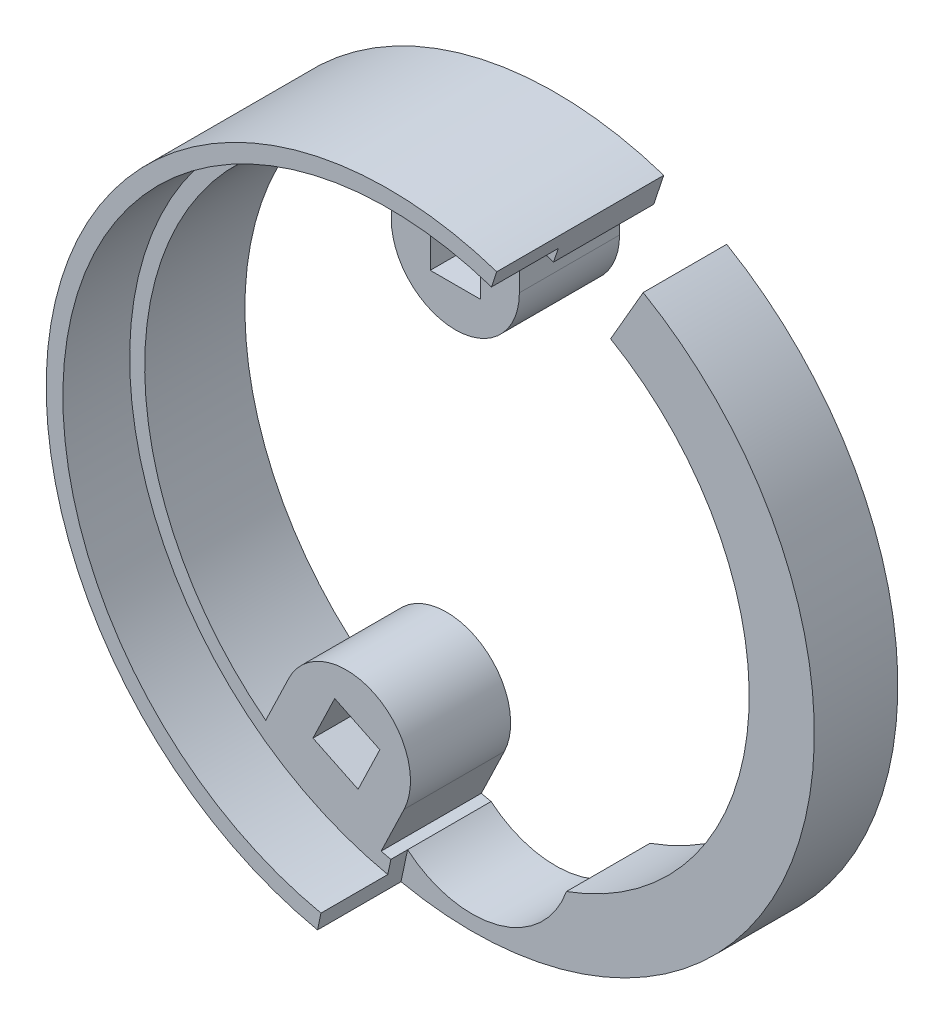
ISO-10303-21;
HEADER;
FILE_DESCRIPTION(('STEP AP214'),'2;1');
FILE_NAME('part.step','',(''),(''),'','','');
FILE_SCHEMA(('AUTOMOTIVE_DESIGN { 1 0 10303 214 1 1 1 1 }'));
ENDSEC;
DATA;
#1=APPLICATION_CONTEXT('core data for automotive mechanical design processes');
#2=APPLICATION_PROTOCOL_DEFINITION('international standard','automotive_design',2000,#1);
#3=PRODUCT_CONTEXT('',#1,'mechanical');
#4=PRODUCT('Part','Part','',(#3));
#5=PRODUCT_RELATED_PRODUCT_CATEGORY('part','',(#4));
#6=PRODUCT_DEFINITION_FORMATION('','',#4);
#7=PRODUCT_DEFINITION_CONTEXT('part definition',#1,'design');
#8=PRODUCT_DEFINITION('design','',#6,#7);
#9=PRODUCT_DEFINITION_SHAPE('','',#8);
#10=(LENGTH_UNIT() NAMED_UNIT(*) SI_UNIT(.MILLI.,.METRE.));
#11=(NAMED_UNIT(*) PLANE_ANGLE_UNIT() SI_UNIT($,.RADIAN.));
#12=(NAMED_UNIT(*) SI_UNIT($,.STERADIAN.) SOLID_ANGLE_UNIT());
#13=UNCERTAINTY_MEASURE_WITH_UNIT(LENGTH_MEASURE(1.E-05),#10,'distance_accuracy_value','');
#14=(GEOMETRIC_REPRESENTATION_CONTEXT(3) GLOBAL_UNCERTAINTY_ASSIGNED_CONTEXT((#13)) GLOBAL_UNIT_ASSIGNED_CONTEXT((#10,
#11,#12)) REPRESENTATION_CONTEXT('',''));
#15=CARTESIAN_POINT('',(0.,0.,0.));
#16=DIRECTION('',(0.,0.,1.));
#17=DIRECTION('',(1.,0.,0.));
#18=AXIS2_PLACEMENT_3D('',#15,#16,#17);
#19=CARTESIAN_POINT('',(0.,0.,6.));
#20=DIRECTION('',(0.,0.,-1.));
#21=DIRECTION('',(-1.,0.,0.));
#22=AXIS2_PLACEMENT_3D('',#19,#20,#21);
#23=CYLINDRICAL_SURFACE('',#22,18.6);
#24=DIRECTION('',(0.,0.,-1.));
#25=VECTOR('',#24,1.);
#26=CARTESIAN_POINT('',(-4.44120798788724,-18.0619952277794,18.0394074165412));
#27=LINE('',#26,#25);
#28=CARTESIAN_POINT('',(-4.44120798788724,-18.0619952277794,6.));
#29=VERTEX_POINT('',#28);
#30=CARTESIAN_POINT('',(-4.44120798788724,-18.0619952277794,0.));
#31=VERTEX_POINT('',#30);
#32=EDGE_CURVE('E300',#29,#31,#27,.T.);
#33=ORIENTED_EDGE('',*,*,#32,.F.);
#34=CARTESIAN_POINT('',(0.,0.,6.));
#35=DIRECTION('',(0.,0.,1.));
#36=DIRECTION('',(1.,0.,0.));
#37=AXIS2_PLACEMENT_3D('',#34,#35,#36);
#38=CIRCLE('',#37,18.6);
#39=CARTESIAN_POINT('',(-3.85753402728042,-18.1955882352941,6.));
#40=VERTEX_POINT('',#39);
#41=EDGE_CURVE('E397',#29,#40,#38,.T.);
#42=ORIENTED_EDGE('',*,*,#41,.T.);
#43=DIRECTION('',(0.,0.,-1.));
#44=VECTOR('',#43,1.);
#45=CARTESIAN_POINT('',(-3.85753402728042,-18.1955882352941,6.));
#46=LINE('',#45,#44);
#47=CARTESIAN_POINT('',(-3.85753402728042,-18.1955882352941,5.));
#48=VERTEX_POINT('',#47);
#49=EDGE_CURVE('E390',#40,#48,#46,.T.);
#50=ORIENTED_EDGE('',*,*,#49,.T.);
#51=CARTESIAN_POINT('',(-3.85753402728042,-18.1955882352941,0.));
#52=VERTEX_POINT('',#51);
#53=EDGE_CURVE('E393',#48,#52,#46,.T.);
#54=ORIENTED_EDGE('',*,*,#53,.T.);
#55=CARTESIAN_POINT('',(0.,0.,0.));
#56=DIRECTION('',(0.,0.,1.));
#57=DIRECTION('',(1.,0.,0.));
#58=AXIS2_PLACEMENT_3D('',#55,#56,#57);
#59=CIRCLE('',#58,18.6);
#60=EDGE_CURVE('E223',#31,#52,#59,.T.);
#61=ORIENTED_EDGE('',*,*,#60,.F.);
#62=EDGE_LOOP('',(#33,#42,#50,#54,#61));
#63=FACE_BOUND('',#62,.T.);
#64=ADVANCED_FACE('F39',(#63),#23,.F.);
#65=DIRECTION('',(0.,0.,-1.));
#66=VECTOR('',#65,1.);
#67=CARTESIAN_POINT('',(-11.3523886168903,-14.7337460508555,18.0394074165412));
#68=LINE('',#67,#66);
#69=CARTESIAN_POINT('',(-11.3523886168903,-14.7337460508555,6.));
#70=VERTEX_POINT('',#69);
#71=CARTESIAN_POINT('',(-11.3523886168903,-14.7337460508555,0.));
#72=VERTEX_POINT('',#71);
#73=EDGE_CURVE('E296',#70,#72,#68,.T.);
#74=ORIENTED_EDGE('',*,*,#73,.T.);
#75=CARTESIAN_POINT('',(-3.83541589238637,18.2002633204146,0.));
#76=VERTEX_POINT('',#75);
#77=EDGE_CURVE('E411',#76,#72,#59,.T.);
#78=ORIENTED_EDGE('',*,*,#77,.F.);
#79=DIRECTION('',(0.,0.,-1.));
#80=VECTOR('',#79,1.);
#81=CARTESIAN_POINT('',(-3.83541589238637,18.2002633204146,18.0394074165412));
#82=LINE('',#81,#80);
#83=CARTESIAN_POINT('',(-3.83541589238637,18.2002633204146,6.));
#84=VERTEX_POINT('',#83);
#85=EDGE_CURVE('E355',#84,#76,#82,.T.);
#86=ORIENTED_EDGE('',*,*,#85,.F.);
#87=EDGE_CURVE('E415',#84,#70,#38,.T.);
#88=ORIENTED_EDGE('',*,*,#87,.T.);
#89=EDGE_LOOP('',(#74,#78,#86,#88));
#90=FACE_BOUND('',#89,.T.);
#91=ADVANCED_FACE('F461',(#90),#23,.F.);
#92=CARTESIAN_POINT('',(0.,0.,6.));
#93=DIRECTION('',(-0.86602540378444,0.499999999999997,0.));
#94=DIRECTION('',(-0.499999999999997,-0.86602540378444,0.));
#95=AXIS2_PLACEMENT_3D('',#92,#93,#94);
#96=PLANE('',#95);
#97=DIRECTION('',(0.,0.,-1.));
#98=VECTOR('',#97,1.);
#99=CARTESIAN_POINT('',(8.29999999999997,14.3760217028217,6.));
#100=LINE('',#99,#98);
#101=CARTESIAN_POINT('',(8.29999999999997,14.3760217028217,5.));
#102=VERTEX_POINT('',#101);
#103=CARTESIAN_POINT('',(8.29999999999997,14.3760217028217,0.));
#104=VERTEX_POINT('',#103);
#105=EDGE_CURVE('E386',#102,#104,#100,.T.);
#106=ORIENTED_EDGE('',*,*,#105,.F.);
#107=DIRECTION('',(-0.499999999999996,-0.866025403784441,0.));
#108=VECTOR('',#107,1.);
#109=CARTESIAN_POINT('',(10.25,17.753520777581,5.));
#110=LINE('',#109,#108);
#111=CARTESIAN_POINT('',(10.25,17.753520777581,5.));
#112=VERTEX_POINT('',#111);
#113=EDGE_CURVE('E373',#112,#102,#110,.T.);
#114=ORIENTED_EDGE('',*,*,#113,.F.);
#115=DIRECTION('',(0.,0.,-1.));
#116=VECTOR('',#115,1.);
#117=CARTESIAN_POINT('',(10.25,17.753520777581,6.));
#118=LINE('',#117,#116);
#119=CARTESIAN_POINT('',(10.25,17.753520777581,0.));
#120=VERTEX_POINT('',#119);
#121=EDGE_CURVE('E384',#112,#120,#118,.T.);
#122=ORIENTED_EDGE('',*,*,#121,.T.);
#123=DIRECTION('',(0.499999999999997,0.86602540378444,0.));
#124=VECTOR('',#123,1.);
#125=CARTESIAN_POINT('',(0.,0.,0.));
#126=LINE('',#125,#124);
#127=EDGE_CURVE('E401',#104,#120,#126,.T.);
#128=ORIENTED_EDGE('',*,*,#127,.F.);
#129=EDGE_LOOP('',(#106,#114,#122,#128));
#130=FACE_BOUND('',#129,.T.);
#131=ADVANCED_FACE('F465',(#130),#96,.T.);
#132=CARTESIAN_POINT('',(0.,0.,6.));
#133=DIRECTION('',(0.,0.,-1.));
#134=DIRECTION('',(-1.,0.,0.));
#135=AXIS2_PLACEMENT_3D('',#132,#133,#134);
#136=CYLINDRICAL_SURFACE('',#135,16.6);
#137=DIRECTION('',(0.,0.,-1.));
#138=VECTOR('',#137,1.);
#139=CARTESIAN_POINT('',(5.65424921360477,-15.6073529411765,6.));
#140=LINE('',#139,#138);
#141=CARTESIAN_POINT('',(5.65424921360477,-15.6073529411765,5.));
#142=VERTEX_POINT('',#141);
#143=CARTESIAN_POINT('',(5.65424921360477,-15.6073529411765,0.));
#144=VERTEX_POINT('',#143);
#145=EDGE_CURVE('E388',#142,#144,#140,.T.);
#146=ORIENTED_EDGE('',*,*,#145,.F.);
#147=CARTESIAN_POINT('',(0.,0.,5.));
#148=DIRECTION('',(0.,0.,-1.));
#149=DIRECTION('',(1.,0.,0.));
#150=AXIS2_PLACEMENT_3D('',#147,#148,#149);
#151=CIRCLE('',#150,16.6);
#152=EDGE_CURVE('E375',#102,#142,#151,.T.);
#153=ORIENTED_EDGE('',*,*,#152,.F.);
#154=ORIENTED_EDGE('',*,*,#105,.T.);
#155=CARTESIAN_POINT('',(0.,0.,0.));
#156=DIRECTION('',(0.,0.,1.));
#157=DIRECTION('',(1.,0.,0.));
#158=AXIS2_PLACEMENT_3D('',#155,#156,#157);
#159=CIRCLE('',#158,16.6);
#160=EDGE_CURVE('E398',#144,#104,#159,.T.);
#161=ORIENTED_EDGE('',*,*,#160,.F.);
#162=EDGE_LOOP('',(#146,#153,#154,#161));
#163=FACE_BOUND('',#162,.T.);
#164=ADVANCED_FACE('F475',(#163),#136,.F.);
#165=CARTESIAN_POINT('',(0.,-13.6,6.));
#166=DIRECTION('',(0.,0.,-1.));
#167=DIRECTION('',(-1.,0.,0.));
#168=AXIS2_PLACEMENT_3D('',#165,#166,#167);
#169=CYLINDRICAL_SURFACE('',#168,6.);
#170=ORIENTED_EDGE('',*,*,#53,.F.);
#171=CARTESIAN_POINT('',(0.,-13.6,5.));
#172=DIRECTION('',(0.,0.,-1.));
#173=DIRECTION('',(1.,0.,0.));
#174=AXIS2_PLACEMENT_3D('',#171,#172,#173);
#175=CIRCLE('',#174,6.);
#176=EDGE_CURVE('E377',#142,#48,#175,.T.);
#177=ORIENTED_EDGE('',*,*,#176,.F.);
#178=ORIENTED_EDGE('',*,*,#145,.T.);
#179=CARTESIAN_POINT('',(0.,-13.6,0.));
#180=DIRECTION('',(0.,0.,1.));
#181=DIRECTION('',(1.,0.,0.));
#182=AXIS2_PLACEMENT_3D('',#179,#180,#181);
#183=CIRCLE('',#182,6.);
#184=EDGE_CURVE('E394',#52,#144,#183,.T.);
#185=ORIENTED_EDGE('',*,*,#184,.F.);
#186=EDGE_LOOP('',(#170,#177,#178,#185));
#187=FACE_BOUND('',#186,.T.);
#188=ADVANCED_FACE('F469',(#187),#169,.F.);
#189=DIRECTION('',(0.,0.,-1.));
#190=VECTOR('',#189,1.);
#191=CARTESIAN_POINT('',(3.83541589239431,18.200263320413,18.0394074165412));
#192=LINE('',#191,#190);
#193=CARTESIAN_POINT('',(3.83541589239431,18.200263320413,6.));
#194=VERTEX_POINT('',#193);
#195=CARTESIAN_POINT('',(3.83541589239431,18.200263320413,0.));
#196=VERTEX_POINT('',#195);
#197=EDGE_CURVE('E351',#194,#196,#192,.T.);
#198=ORIENTED_EDGE('',*,*,#197,.T.);
#199=CARTESIAN_POINT('',(5.88204496096024,17.6454398380217,0.));
#200=VERTEX_POINT('',#199);
#201=EDGE_CURVE('E409',#200,#196,#59,.T.);
#202=ORIENTED_EDGE('',*,*,#201,.F.);
#203=DIRECTION('',(0.,0.,-1.));
#204=VECTOR('',#203,1.);
#205=CARTESIAN_POINT('',(5.88204496096024,17.6454398380217,6.));
#206=LINE('',#205,#204);
#207=CARTESIAN_POINT('',(5.88204496096024,17.6454398380217,6.));
#208=VERTEX_POINT('',#207);
#209=EDGE_CURVE('E11',#208,#200,#206,.T.);
#210=ORIENTED_EDGE('',*,*,#209,.F.);
#211=EDGE_CURVE('E413',#208,#194,#38,.T.);
#212=ORIENTED_EDGE('',*,*,#211,.T.);
#213=EDGE_LOOP('',(#198,#202,#210,#212));
#214=FACE_BOUND('',#213,.T.);
#215=ADVANCED_FACE('F41',(#214),#23,.F.);
#216=CARTESIAN_POINT('',(0.,0.,6.));
#217=DIRECTION('',(-0.948679561183961,0.316238976395712,0.));
#218=DIRECTION('',(-0.316238976395712,-0.948679561183961,0.));
#219=AXIS2_PLACEMENT_3D('',#216,#217,#218);
#220=PLANE('',#219);
#221=DIRECTION('',(0.316238976395712,0.948679561183961,0.));
#222=VECTOR('',#221,1.);
#223=CARTESIAN_POINT('',(0.,0.,0.));
#224=LINE('',#223,#222);
#225=CARTESIAN_POINT('',(6.48289901611209,19.4479310042712,0.));
#226=VERTEX_POINT('',#225);
#227=EDGE_CURVE('E407',#200,#226,#224,.T.);
#228=ORIENTED_EDGE('',*,*,#227,.T.);
#229=DIRECTION('',(0.,0.,-1.));
#230=VECTOR('',#229,1.);
#231=CARTESIAN_POINT('',(6.48289901611209,19.4479310042712,6.));
#232=LINE('',#231,#230);
#233=CARTESIAN_POINT('',(6.48289901611209,19.4479310042712,10.));
#234=VERTEX_POINT('',#233);
#235=EDGE_CURVE('E48',#234,#226,#232,.T.);
#236=ORIENTED_EDGE('',*,*,#235,.F.);
#237=DIRECTION('',(0.316238976395713,0.94867956118396,0.));
#238=VECTOR('',#237,1.);
#239=CARTESIAN_POINT('',(6.16666003971638,18.4992514430872,10.));
#240=LINE('',#239,#238);
#241=CARTESIAN_POINT('',(6.16666003971638,18.4992514430872,10.));
#242=VERTEX_POINT('',#241);
#243=EDGE_CURVE('E238',#242,#234,#240,.T.);
#244=ORIENTED_EDGE('',*,*,#243,.F.);
#245=DIRECTION('',(0.,0.,-1.));
#246=VECTOR('',#245,1.);
#247=CARTESIAN_POINT('',(6.16666003971638,18.4992514430872,10.));
#248=LINE('',#247,#246);
#249=CARTESIAN_POINT('',(6.16666003971638,18.4992514430872,6.));
#250=VERTEX_POINT('',#249);
#251=EDGE_CURVE('E244',#242,#250,#248,.T.);
#252=ORIENTED_EDGE('',*,*,#251,.T.);
#253=DIRECTION('',(0.316238976395712,0.948679561183961,0.));
#254=VECTOR('',#253,1.);
#255=CARTESIAN_POINT('',(0.,0.,6.));
#256=LINE('',#255,#254);
#257=EDGE_CURVE('E251',#208,#250,#256,.T.);
#258=ORIENTED_EDGE('',*,*,#257,.F.);
#259=ORIENTED_EDGE('',*,*,#209,.T.);
#260=EDGE_LOOP('',(#228,#236,#244,#252,#258,#259));
#261=FACE_BOUND('',#260,.T.);
#262=ADVANCED_FACE('F468',(#261),#220,.F.);
#263=CARTESIAN_POINT('',(0.,0.,6.));
#264=DIRECTION('',(0.,0.,-1.));
#265=DIRECTION('',(-1.,0.,0.));
#266=AXIS2_PLACEMENT_3D('',#263,#264,#265);
#267=CYLINDRICAL_SURFACE('',#266,20.5);
#268=CARTESIAN_POINT('',(0.,0.,5.));
#269=DIRECTION('',(0.,0.,1.));
#270=DIRECTION('',(1.,0.,0.));
#271=AXIS2_PLACEMENT_3D('',#268,#269,#270);
#272=CIRCLE('',#271,20.5);
#273=CARTESIAN_POINT('',(-4.25158320211014,-20.0542773561037,5.));
#274=VERTEX_POINT('',#273);
#275=EDGE_CURVE('E219',#274,#112,#272,.T.);
#276=ORIENTED_EDGE('',*,*,#275,.F.);
#277=DIRECTION('',(0.,0.,1.));
#278=VECTOR('',#277,1.);
#279=CARTESIAN_POINT('',(-4.25158320211014,-20.0542773561037,5.));
#280=LINE('',#279,#278);
#281=CARTESIAN_POINT('',(-4.25158320211014,-20.0542773561037,10.));
#282=VERTEX_POINT('',#281);
#283=EDGE_CURVE('E212',#274,#282,#280,.T.);
#284=ORIENTED_EDGE('',*,*,#283,.T.);
#285=CARTESIAN_POINT('',(0.,0.,10.));
#286=DIRECTION('',(0.,0.,1.));
#287=DIRECTION('',(1.,0.,0.));
#288=AXIS2_PLACEMENT_3D('',#285,#286,#287);
#289=CIRCLE('',#288,20.5);
#290=EDGE_CURVE('E217',#234,#282,#289,.T.);
#291=ORIENTED_EDGE('',*,*,#290,.F.);
#292=ORIENTED_EDGE('',*,*,#235,.T.);
#293=CARTESIAN_POINT('',(0.,0.,0.));
#294=DIRECTION('',(0.,0.,1.));
#295=DIRECTION('',(1.,0.,0.));
#296=AXIS2_PLACEMENT_3D('',#293,#294,#295);
#297=CIRCLE('',#296,20.5);
#298=EDGE_CURVE('E404',#226,#120,#297,.T.);
#299=ORIENTED_EDGE('',*,*,#298,.T.);
#300=ORIENTED_EDGE('',*,*,#121,.F.);
#301=EDGE_LOOP('',(#276,#284,#291,#292,#299,#300));
#302=FACE_BOUND('',#301,.T.);
#303=ADVANCED_FACE('F214',(#302),#267,.T.);
#304=CARTESIAN_POINT('',(0.,0.,6.));
#305=DIRECTION('',(0.,0.,1.));
#306=DIRECTION('',(1.,0.,0.));
#307=AXIS2_PLACEMENT_3D('',#304,#305,#306);
#308=PLANE('',#307);
#309=CARTESIAN_POINT('',(0.,0.,6.));
#310=DIRECTION('',(0.,0.,-1.));
#311=DIRECTION('',(1.,0.,0.));
#312=AXIS2_PLACEMENT_3D('',#309,#310,#311);
#313=CIRCLE('',#312,19.5);
#314=CARTESIAN_POINT('',(-4.04418889956818,-19.0760199240987,6.));
#315=VERTEX_POINT('',#314);
#316=EDGE_CURVE('E56',#315,#250,#313,.T.);
#317=ORIENTED_EDGE('',*,*,#316,.F.);
#318=DIRECTION('',(-0.207394302541957,-0.97825743200506,0.));
#319=VECTOR('',#318,1.);
#320=CARTESIAN_POINT('',(-3.85753402728042,-18.1955882352941,6.));
#321=LINE('',#320,#319);
#322=EDGE_CURVE('E371',#40,#315,#321,.T.);
#323=ORIENTED_EDGE('',*,*,#322,.F.);
#324=ORIENTED_EDGE('',*,*,#41,.F.);
#325=DIRECTION('',(-0.433883739117553,-0.900968867902422,0.));
#326=VECTOR('',#325,1.);
#327=CARTESIAN_POINT('',(3.4555903144983,-1.66412458845948,6.));
#328=LINE('',#327,#326);
#329=CARTESIAN_POINT('',(-3.06532979610734,-15.2049547234712,6.));
#330=VERTEX_POINT('',#329);
#331=EDGE_CURVE('E247',#330,#29,#328,.T.);
#332=ORIENTED_EDGE('',*,*,#331,.F.);
#333=CARTESIAN_POINT('',(-6.52092011060922,-13.54083013501,6.));
#334=DIRECTION('',(0.,0.,1.));
#335=DIRECTION('',(1.,0.,0.));
#336=AXIS2_PLACEMENT_3D('',#333,#334,#335);
#337=CIRCLE('',#336,3.83541589239033);
#338=CARTESIAN_POINT('',(-9.97651042511108,-11.8767055465487,6.));
#339=VERTEX_POINT('',#338);
#340=EDGE_CURVE('E299',#339,#330,#337,.F.);
#341=ORIENTED_EDGE('',*,*,#340,.F.);
#342=DIRECTION('',(0.433883739117553,0.900968867902422,0.));
#343=VECTOR('',#342,1.);
#344=CARTESIAN_POINT('',(-3.45559031450545,1.66412458846292,6.));
#345=LINE('',#344,#343);
#346=EDGE_CURVE('E258',#70,#339,#345,.T.);
#347=ORIENTED_EDGE('',*,*,#346,.F.);
#348=ORIENTED_EDGE('',*,*,#87,.F.);
#349=DIRECTION('',(0.,1.,0.));
#350=VECTOR('',#349,1.);
#351=CARTESIAN_POINT('',(-3.83541589238637,0.,6.));
#352=LINE('',#351,#350);
#353=CARTESIAN_POINT('',(-3.83541589238637,15.0291875972769,6.));
#354=VERTEX_POINT('',#353);
#355=EDGE_CURVE('E315',#354,#84,#352,.T.);
#356=ORIENTED_EDGE('',*,*,#355,.F.);
#357=CARTESIAN_POINT('',(3.97034835564192E-12,15.0291875972769,6.));
#358=DIRECTION('',(0.,0.,1.));
#359=DIRECTION('',(1.,0.,0.));
#360=AXIS2_PLACEMENT_3D('',#357,#358,#359);
#361=CIRCLE('',#360,3.83541589239034);
#362=CARTESIAN_POINT('',(3.83541589239431,15.0291875972769,6.));
#363=VERTEX_POINT('',#362);
#364=EDGE_CURVE('E354',#363,#354,#361,.F.);
#365=ORIENTED_EDGE('',*,*,#364,.F.);
#366=DIRECTION('',(0.,-1.,0.));
#367=VECTOR('',#366,1.);
#368=CARTESIAN_POINT('',(3.83541589239431,0.,6.));
#369=LINE('',#368,#367);
#370=EDGE_CURVE('E317',#194,#363,#369,.T.);
#371=ORIENTED_EDGE('',*,*,#370,.F.);
#372=ORIENTED_EDGE('',*,*,#211,.F.);
#373=ORIENTED_EDGE('',*,*,#257,.T.);
#374=EDGE_LOOP('',(#317,#323,#324,#332,#341,#347,#348,#356,#365,#371,#372,#373));
#375=FACE_BOUND('',#374,.T.);
#376=DIRECTION('',(1.,0.,0.));
#377=VECTOR('',#376,1.);
#378=CARTESIAN_POINT('',(0.,13.5291875972755,6.));
#379=LINE('',#378,#377);
#380=CARTESIAN_POINT('',(-1.49999999999748,13.5291875972755,6.));
#381=VERTEX_POINT('',#380);
#382=CARTESIAN_POINT('',(1.50000000000539,13.5291875972755,6.));
#383=VERTEX_POINT('',#382);
#384=EDGE_CURVE('E327',#381,#383,#379,.T.);
#385=ORIENTED_EDGE('',*,*,#384,.F.);
#386=DIRECTION('',(0.,1.,0.));
#387=VECTOR('',#386,1.);
#388=CARTESIAN_POINT('',(-1.49999999999748,0.,6.));
#389=LINE('',#388,#387);
#390=CARTESIAN_POINT('',(-1.49999999999748,16.5291875972783,6.));
#391=VERTEX_POINT('',#390);
#392=EDGE_CURVE('E325',#381,#391,#389,.T.);
#393=ORIENTED_EDGE('',*,*,#392,.T.);
#394=DIRECTION('',(1.,0.,0.));
#395=VECTOR('',#394,1.);
#396=CARTESIAN_POINT('',(0.,16.5291875972783,6.));
#397=LINE('',#396,#395);
#398=CARTESIAN_POINT('',(1.50000000000539,16.5291875972783,6.));
#399=VERTEX_POINT('',#398);
#400=EDGE_CURVE('E323',#391,#399,#397,.T.);
#401=ORIENTED_EDGE('',*,*,#400,.T.);
#402=DIRECTION('',(0.,1.,0.));
#403=VECTOR('',#402,1.);
#404=CARTESIAN_POINT('',(1.50000000000539,0.,6.));
#405=LINE('',#404,#403);
#406=EDGE_CURVE('E320',#383,#399,#405,.T.);
#407=ORIENTED_EDGE('',*,*,#406,.F.);
#408=EDGE_LOOP('',(#385,#393,#401,#407));
#409=FACE_BOUND('',#408,.T.);
#410=DIRECTION('',(-0.900968867902422,0.433883739117552,0.));
#411=VECTOR('',#410,1.);
#412=CARTESIAN_POINT('',(-5.87009450192869,-12.1893768331568,6.));
#413=LINE('',#412,#411);
#414=CARTESIAN_POINT('',(-4.51864120007733,-12.840202441832,6.));
#415=VERTEX_POINT('',#414);
#416=CARTESIAN_POINT('',(-7.22154780378718,-11.5385512244781,6.));
#417=VERTEX_POINT('',#416);
#418=EDGE_CURVE('E274',#415,#417,#413,.T.);
#419=ORIENTED_EDGE('',*,*,#418,.F.);
#420=DIRECTION('',(-0.433883739117553,-0.900968867902422,0.));
#421=VECTOR('',#420,1.);
#422=CARTESIAN_POINT('',(1.35145330185137,-0.650825608675239,6.));
#423=LINE('',#422,#421);
#424=CARTESIAN_POINT('',(-5.82029241743123,-15.5431090455418,6.));
#425=VERTEX_POINT('',#424);
#426=EDGE_CURVE('E272',#415,#425,#423,.T.);
#427=ORIENTED_EDGE('',*,*,#426,.T.);
#428=DIRECTION('',(-0.900968867902422,0.433883739117553,0.));
#429=VECTOR('',#428,1.);
#430=CARTESIAN_POINT('',(-7.17174571928259,-14.8922834368666,6.));
#431=LINE('',#430,#429);
#432=CARTESIAN_POINT('',(-8.52319902114108,-14.2414578281879,6.));
#433=VERTEX_POINT('',#432);
#434=EDGE_CURVE('E268',#425,#433,#431,.T.);
#435=ORIENTED_EDGE('',*,*,#434,.T.);
#436=DIRECTION('',(-0.433883739117553,-0.900968867902422,0.));
#437=VECTOR('',#436,1.);
#438=CARTESIAN_POINT('',(-1.35145330185848,0.650825608678665,6.));
#439=LINE('',#438,#437);
#440=EDGE_CURVE('E263',#417,#433,#439,.T.);
#441=ORIENTED_EDGE('',*,*,#440,.F.);
#442=EDGE_LOOP('',(#419,#427,#435,#441));
#443=FACE_BOUND('',#442,.T.);
#444=ADVANCED_FACE('F425',(#375,#409,#443),#308,.T.);
#445=CARTESIAN_POINT('',(0.,0.,0.));
#446=DIRECTION('',(0.,0.,1.));
#447=DIRECTION('',(1.,0.,0.));
#448=AXIS2_PLACEMENT_3D('',#445,#446,#447);
#449=PLANE('',#448);
#450=ORIENTED_EDGE('',*,*,#201,.T.);
#451=DIRECTION('',(0.,-1.,0.));
#452=VECTOR('',#451,1.);
#453=CARTESIAN_POINT('',(3.83541589239431,0.,0.));
#454=LINE('',#453,#452);
#455=CARTESIAN_POINT('',(3.83541589239431,15.0291875972769,0.));
#456=VERTEX_POINT('',#455);
#457=EDGE_CURVE('E342',#196,#456,#454,.T.);
#458=ORIENTED_EDGE('',*,*,#457,.T.);
#459=CARTESIAN_POINT('',(3.97034835564192E-12,15.0291875972769,0.));
#460=DIRECTION('',(0.,0.,-1.));
#461=DIRECTION('',(-1.,0.,0.));
#462=AXIS2_PLACEMENT_3D('',#459,#460,#461);
#463=CIRCLE('',#462,3.83541589239034);
#464=CARTESIAN_POINT('',(-3.83541589238637,15.0291875972769,0.));
#465=VERTEX_POINT('',#464);
#466=EDGE_CURVE('E345',#456,#465,#463,.T.);
#467=ORIENTED_EDGE('',*,*,#466,.T.);
#468=DIRECTION('',(0.,1.,0.));
#469=VECTOR('',#468,1.);
#470=CARTESIAN_POINT('',(-3.83541589238637,0.,0.));
#471=LINE('',#470,#469);
#472=EDGE_CURVE('E348',#465,#76,#471,.T.);
#473=ORIENTED_EDGE('',*,*,#472,.T.);
#474=ORIENTED_EDGE('',*,*,#77,.T.);
#475=DIRECTION('',(0.433883739117553,0.900968867902422,0.));
#476=VECTOR('',#475,1.);
#477=CARTESIAN_POINT('',(-3.45559031450545,1.66412458846292,0.));
#478=LINE('',#477,#476);
#479=CARTESIAN_POINT('',(-9.97651042511108,-11.8767055465487,0.));
#480=VERTEX_POINT('',#479);
#481=EDGE_CURVE('E289',#72,#480,#478,.T.);
#482=ORIENTED_EDGE('',*,*,#481,.T.);
#483=CARTESIAN_POINT('',(-6.52092011060922,-13.54083013501,0.));
#484=DIRECTION('',(0.,0.,-1.));
#485=DIRECTION('',(-1.,0.,0.));
#486=AXIS2_PLACEMENT_3D('',#483,#484,#485);
#487=CIRCLE('',#486,3.83541589239033);
#488=CARTESIAN_POINT('',(-3.06532979610734,-15.2049547234712,0.));
#489=VERTEX_POINT('',#488);
#490=EDGE_CURVE('E292',#480,#489,#487,.T.);
#491=ORIENTED_EDGE('',*,*,#490,.T.);
#492=DIRECTION('',(-0.433883739117553,-0.900968867902422,0.));
#493=VECTOR('',#492,1.);
#494=CARTESIAN_POINT('',(3.4555903144983,-1.66412458845948,0.));
#495=LINE('',#494,#493);
#496=EDGE_CURVE('E64',#489,#31,#495,.T.);
#497=ORIENTED_EDGE('',*,*,#496,.T.);
#498=ORIENTED_EDGE('',*,*,#60,.T.);
#499=ORIENTED_EDGE('',*,*,#184,.T.);
#500=ORIENTED_EDGE('',*,*,#160,.T.);
#501=ORIENTED_EDGE('',*,*,#127,.T.);
#502=ORIENTED_EDGE('',*,*,#298,.F.);
#503=ORIENTED_EDGE('',*,*,#227,.F.);
#504=EDGE_LOOP('',(#450,#458,#467,#473,#474,#482,#491,#497,#498,#499,#500,#501,#502,#503));
#505=FACE_BOUND('',#504,.T.);
#506=DIRECTION('',(1.,0.,0.));
#507=VECTOR('',#506,1.);
#508=CARTESIAN_POINT('',(0.,13.5291875972755,0.));
#509=LINE('',#508,#507);
#510=CARTESIAN_POINT('',(-1.49999999999748,13.5291875972755,0.));
#511=VERTEX_POINT('',#510);
#512=CARTESIAN_POINT('',(1.50000000000539,13.5291875972755,0.));
#513=VERTEX_POINT('',#512);
#514=EDGE_CURVE('E330',#511,#513,#509,.T.);
#515=ORIENTED_EDGE('',*,*,#514,.T.);
#516=DIRECTION('',(0.,1.,0.));
#517=VECTOR('',#516,1.);
#518=CARTESIAN_POINT('',(1.50000000000539,0.,0.));
#519=LINE('',#518,#517);
#520=CARTESIAN_POINT('',(1.50000000000539,16.5291875972783,0.));
#521=VERTEX_POINT('',#520);
#522=EDGE_CURVE('E333',#513,#521,#519,.T.);
#523=ORIENTED_EDGE('',*,*,#522,.T.);
#524=DIRECTION('',(1.,0.,0.));
#525=VECTOR('',#524,1.);
#526=CARTESIAN_POINT('',(0.,16.5291875972783,0.));
#527=LINE('',#526,#525);
#528=CARTESIAN_POINT('',(-1.49999999999748,16.5291875972783,0.));
#529=VERTEX_POINT('',#528);
#530=EDGE_CURVE('E336',#529,#521,#527,.T.);
#531=ORIENTED_EDGE('',*,*,#530,.F.);
#532=DIRECTION('',(0.,1.,0.));
#533=VECTOR('',#532,1.);
#534=CARTESIAN_POINT('',(-1.49999999999748,0.,0.));
#535=LINE('',#534,#533);
#536=EDGE_CURVE('E339',#511,#529,#535,.T.);
#537=ORIENTED_EDGE('',*,*,#536,.F.);
#538=EDGE_LOOP('',(#515,#523,#531,#537));
#539=FACE_BOUND('',#538,.T.);
#540=DIRECTION('',(-0.900968867902422,0.433883739117552,0.));
#541=VECTOR('',#540,1.);
#542=CARTESIAN_POINT('',(-5.87009450192869,-12.1893768331568,0.));
#543=LINE('',#542,#541);
#544=CARTESIAN_POINT('',(-4.51864120007733,-12.840202441832,0.));
#545=VERTEX_POINT('',#544);
#546=CARTESIAN_POINT('',(-7.22154780378718,-11.5385512244781,0.));
#547=VERTEX_POINT('',#546);
#548=EDGE_CURVE('E277',#545,#547,#543,.T.);
#549=ORIENTED_EDGE('',*,*,#548,.T.);
#550=DIRECTION('',(-0.433883739117553,-0.900968867902422,0.));
#551=VECTOR('',#550,1.);
#552=CARTESIAN_POINT('',(-1.35145330185848,0.650825608678665,0.));
#553=LINE('',#552,#551);
#554=CARTESIAN_POINT('',(-8.52319902114108,-14.2414578281879,0.));
#555=VERTEX_POINT('',#554);
#556=EDGE_CURVE('E280',#547,#555,#553,.T.);
#557=ORIENTED_EDGE('',*,*,#556,.T.);
#558=DIRECTION('',(-0.900968867902422,0.433883739117553,0.));
#559=VECTOR('',#558,1.);
#560=CARTESIAN_POINT('',(-7.17174571928259,-14.8922834368666,0.));
#561=LINE('',#560,#559);
#562=CARTESIAN_POINT('',(-5.82029241743123,-15.5431090455418,0.));
#563=VERTEX_POINT('',#562);
#564=EDGE_CURVE('E283',#563,#555,#561,.T.);
#565=ORIENTED_EDGE('',*,*,#564,.F.);
#566=DIRECTION('',(-0.433883739117553,-0.900968867902422,0.));
#567=VECTOR('',#566,1.);
#568=CARTESIAN_POINT('',(1.35145330185137,-0.650825608675239,0.));
#569=LINE('',#568,#567);
#570=EDGE_CURVE('E286',#545,#563,#569,.T.);
#571=ORIENTED_EDGE('',*,*,#570,.F.);
#572=EDGE_LOOP('',(#549,#557,#565,#571));
#573=FACE_BOUND('',#572,.T.);
#574=ADVANCED_FACE('F428',(#505,#539,#573),#449,.F.);
#575=CARTESIAN_POINT('',(-3.85753402728042,-18.1955882352941,5.));
#576=DIRECTION('',(-0.97825743200506,0.207394302541957,0.));
#577=DIRECTION('',(-0.207394302541957,-0.97825743200506,0.));
#578=AXIS2_PLACEMENT_3D('',#575,#576,#577);
#579=PLANE('',#578);
#580=ORIENTED_EDGE('',*,*,#322,.T.);
#581=DIRECTION('',(0.,0.,-1.));
#582=VECTOR('',#581,1.);
#583=CARTESIAN_POINT('',(-4.04418889956818,-19.0760199240987,10.));
#584=LINE('',#583,#582);
#585=CARTESIAN_POINT('',(-4.04418889956818,-19.0760199240987,10.));
#586=VERTEX_POINT('',#585);
#587=EDGE_CURVE('E230',#586,#315,#584,.T.);
#588=ORIENTED_EDGE('',*,*,#587,.F.);
#589=DIRECTION('',(0.207394302541957,0.978257432005061,0.));
#590=VECTOR('',#589,1.);
#591=CARTESIAN_POINT('',(-4.04418889956818,-19.0760199240987,10.));
#592=LINE('',#591,#590);
#593=EDGE_CURVE('E227',#282,#586,#592,.T.);
#594=ORIENTED_EDGE('',*,*,#593,.F.);
#595=ORIENTED_EDGE('',*,*,#283,.F.);
#596=DIRECTION('',(-0.207394302541957,-0.97825743200506,0.));
#597=VECTOR('',#596,1.);
#598=CARTESIAN_POINT('',(-3.85753402728042,-18.1955882352941,5.));
#599=LINE('',#598,#597);
#600=EDGE_CURVE('E224',#48,#274,#599,.T.);
#601=ORIENTED_EDGE('',*,*,#600,.F.);
#602=ORIENTED_EDGE('',*,*,#49,.F.);
#603=EDGE_LOOP('',(#580,#588,#594,#595,#601,#602));
#604=FACE_BOUND('',#603,.T.);
#605=ADVANCED_FACE('F228',(#604),#579,.F.);
#606=CARTESIAN_POINT('',(0.,0.,5.));
#607=DIRECTION('',(0.,0.,1.));
#608=DIRECTION('',(1.,0.,0.));
#609=AXIS2_PLACEMENT_3D('',#606,#607,#608);
#610=PLANE('',#609);
#611=ORIENTED_EDGE('',*,*,#275,.T.);
#612=ORIENTED_EDGE('',*,*,#113,.T.);
#613=ORIENTED_EDGE('',*,*,#152,.T.);
#614=ORIENTED_EDGE('',*,*,#176,.T.);
#615=ORIENTED_EDGE('',*,*,#600,.T.);
#616=EDGE_LOOP('',(#611,#612,#613,#614,#615));
#617=FACE_BOUND('',#616,.T.);
#618=ADVANCED_FACE('F456',(#617),#610,.T.);
#619=CARTESIAN_POINT('',(1.50000000000539,0.,18.0394074165412));
#620=DIRECTION('',(-1.,0.,0.));
#621=DIRECTION('',(0.,-1.,0.));
#622=AXIS2_PLACEMENT_3D('',#619,#620,#621);
#623=PLANE('',#622);
#624=DIRECTION('',(0.,0.,-1.));
#625=VECTOR('',#624,1.);
#626=CARTESIAN_POINT('',(1.50000000000539,13.5291875972755,18.0394074165412));
#627=LINE('',#626,#625);
#628=EDGE_CURVE('E350',#383,#513,#627,.T.);
#629=ORIENTED_EDGE('',*,*,#628,.F.);
#630=ORIENTED_EDGE('',*,*,#406,.T.);
#631=DIRECTION('',(0.,0.,-1.));
#632=VECTOR('',#631,1.);
#633=CARTESIAN_POINT('',(1.50000000000539,16.5291875972783,18.0394074165412));
#634=LINE('',#633,#632);
#635=EDGE_CURVE('E366',#399,#521,#634,.T.);
#636=ORIENTED_EDGE('',*,*,#635,.T.);
#637=ORIENTED_EDGE('',*,*,#522,.F.);
#638=EDGE_LOOP('',(#629,#630,#636,#637));
#639=FACE_BOUND('',#638,.T.);
#640=ADVANCED_FACE('F543',(#639),#623,.T.);
#641=CARTESIAN_POINT('',(0.,16.5291875972783,18.0394074165412));
#642=DIRECTION('',(0.,1.,0.));
#643=DIRECTION('',(0.,0.,1.));
#644=AXIS2_PLACEMENT_3D('',#641,#642,#643);
#645=PLANE('',#644);
#646=ORIENTED_EDGE('',*,*,#400,.F.);
#647=DIRECTION('',(0.,0.,-1.));
#648=VECTOR('',#647,1.);
#649=CARTESIAN_POINT('',(-1.49999999999748,16.5291875972783,18.0394074165412));
#650=LINE('',#649,#648);
#651=EDGE_CURVE('E364',#391,#529,#650,.T.);
#652=ORIENTED_EDGE('',*,*,#651,.T.);
#653=ORIENTED_EDGE('',*,*,#530,.T.);
#654=ORIENTED_EDGE('',*,*,#635,.F.);
#655=EDGE_LOOP('',(#646,#652,#653,#654));
#656=FACE_BOUND('',#655,.T.);
#657=ADVANCED_FACE('F539',(#656),#645,.F.);
#658=CARTESIAN_POINT('',(-1.49999999999748,0.,18.0394074165412));
#659=DIRECTION('',(-1.,0.,0.));
#660=DIRECTION('',(0.,-1.,0.));
#661=AXIS2_PLACEMENT_3D('',#658,#659,#660);
#662=PLANE('',#661);
#663=ORIENTED_EDGE('',*,*,#392,.F.);
#664=DIRECTION('',(0.,0.,-1.));
#665=VECTOR('',#664,1.);
#666=CARTESIAN_POINT('',(-1.49999999999748,13.5291875972755,18.0394074165412));
#667=LINE('',#666,#665);
#668=EDGE_CURVE('E362',#381,#511,#667,.T.);
#669=ORIENTED_EDGE('',*,*,#668,.T.);
#670=ORIENTED_EDGE('',*,*,#536,.T.);
#671=ORIENTED_EDGE('',*,*,#651,.F.);
#672=EDGE_LOOP('',(#663,#669,#670,#671));
#673=FACE_BOUND('',#672,.T.);
#674=ADVANCED_FACE('F536',(#673),#662,.F.);
#675=CARTESIAN_POINT('',(0.,13.5291875972755,18.0394074165412));
#676=DIRECTION('',(0.,1.,0.));
#677=DIRECTION('',(0.,0.,1.));
#678=AXIS2_PLACEMENT_3D('',#675,#676,#677);
#679=PLANE('',#678);
#680=ORIENTED_EDGE('',*,*,#668,.F.);
#681=ORIENTED_EDGE('',*,*,#384,.T.);
#682=ORIENTED_EDGE('',*,*,#628,.T.);
#683=ORIENTED_EDGE('',*,*,#514,.F.);
#684=EDGE_LOOP('',(#680,#681,#682,#683));
#685=FACE_BOUND('',#684,.T.);
#686=ADVANCED_FACE('F532',(#685),#679,.T.);
#687=CARTESIAN_POINT('',(3.97034835564192E-12,15.0291875972769,18.0394074165412));
#688=DIRECTION('',(0.,0.,-1.));
#689=DIRECTION('',(-1.,0.,0.));
#690=AXIS2_PLACEMENT_3D('',#687,#688,#689);
#691=CYLINDRICAL_SURFACE('',#690,3.83541589239034);
#692=DIRECTION('',(0.,0.,-1.));
#693=VECTOR('',#692,1.);
#694=CARTESIAN_POINT('',(3.83541589239431,15.0291875972769,18.0394074165412));
#695=LINE('',#694,#693);
#696=EDGE_CURVE('E360',#363,#456,#695,.T.);
#697=ORIENTED_EDGE('',*,*,#696,.F.);
#698=ORIENTED_EDGE('',*,*,#364,.T.);
#699=DIRECTION('',(0.,0.,-1.));
#700=VECTOR('',#699,1.);
#701=CARTESIAN_POINT('',(-3.83541589238637,15.0291875972769,18.0394074165412));
#702=LINE('',#701,#700);
#703=EDGE_CURVE('E358',#354,#465,#702,.T.);
#704=ORIENTED_EDGE('',*,*,#703,.T.);
#705=ORIENTED_EDGE('',*,*,#466,.F.);
#706=EDGE_LOOP('',(#697,#698,#704,#705));
#707=FACE_BOUND('',#706,.T.);
#708=ADVANCED_FACE('F528',(#707),#691,.T.);
#709=CARTESIAN_POINT('',(-3.83541589238637,0.,18.0394074165412));
#710=DIRECTION('',(-1.,0.,0.));
#711=DIRECTION('',(0.,0.,1.));
#712=AXIS2_PLACEMENT_3D('',#709,#710,#711);
#713=PLANE('',#712);
#714=ORIENTED_EDGE('',*,*,#703,.F.);
#715=ORIENTED_EDGE('',*,*,#355,.T.);
#716=ORIENTED_EDGE('',*,*,#85,.T.);
#717=ORIENTED_EDGE('',*,*,#472,.F.);
#718=EDGE_LOOP('',(#714,#715,#716,#717));
#719=FACE_BOUND('',#718,.T.);
#720=ADVANCED_FACE('F525',(#719),#713,.T.);
#721=CARTESIAN_POINT('',(3.83541589239431,0.,18.0394074165412));
#722=DIRECTION('',(1.,0.,0.));
#723=DIRECTION('',(0.,0.,-1.));
#724=AXIS2_PLACEMENT_3D('',#721,#722,#723);
#725=PLANE('',#724);
#726=ORIENTED_EDGE('',*,*,#197,.F.);
#727=ORIENTED_EDGE('',*,*,#370,.T.);
#728=ORIENTED_EDGE('',*,*,#696,.T.);
#729=ORIENTED_EDGE('',*,*,#457,.F.);
#730=EDGE_LOOP('',(#726,#727,#728,#729));
#731=FACE_BOUND('',#730,.T.);
#732=ADVANCED_FACE('F522',(#731),#725,.T.);
#733=CARTESIAN_POINT('',(-1.35145330185848,0.650825608678665,18.0394074165412));
#734=DIRECTION('',(0.900968867902422,-0.433883739117553,0.));
#735=DIRECTION('',(0.433883739117553,0.900968867902422,0.));
#736=AXIS2_PLACEMENT_3D('',#733,#734,#735);
#737=PLANE('',#736);
#738=DIRECTION('',(0.,0.,-1.));
#739=VECTOR('',#738,1.);
#740=CARTESIAN_POINT('',(-7.22154780378718,-11.5385512244781,18.0394074165412));
#741=LINE('',#740,#739);
#742=EDGE_CURVE('E295',#417,#547,#741,.T.);
#743=ORIENTED_EDGE('',*,*,#742,.F.);
#744=ORIENTED_EDGE('',*,*,#440,.T.);
#745=DIRECTION('',(0.,0.,-1.));
#746=VECTOR('',#745,1.);
#747=CARTESIAN_POINT('',(-8.52319902114108,-14.2414578281879,18.0394074165412));
#748=LINE('',#747,#746);
#749=EDGE_CURVE('E310',#433,#555,#748,.T.);
#750=ORIENTED_EDGE('',*,*,#749,.T.);
#751=ORIENTED_EDGE('',*,*,#556,.F.);
#752=EDGE_LOOP('',(#743,#744,#750,#751));
#753=FACE_BOUND('',#752,.T.);
#754=ADVANCED_FACE('F449',(#753),#737,.T.);
#755=CARTESIAN_POINT('',(-7.17174571928259,-14.8922834368666,18.0394074165412));
#756=DIRECTION('',(-0.433883739117553,-0.900968867902422,0.));
#757=DIRECTION('',(0.900968867902422,-0.433883739117553,0.));
#758=AXIS2_PLACEMENT_3D('',#755,#756,#757);
#759=PLANE('',#758);
#760=ORIENTED_EDGE('',*,*,#434,.F.);
#761=DIRECTION('',(0.,0.,-1.));
#762=VECTOR('',#761,1.);
#763=CARTESIAN_POINT('',(-5.82029241743123,-15.5431090455418,18.0394074165412));
#764=LINE('',#763,#762);
#765=EDGE_CURVE('E308',#425,#563,#764,.T.);
#766=ORIENTED_EDGE('',*,*,#765,.T.);
#767=ORIENTED_EDGE('',*,*,#564,.T.);
#768=ORIENTED_EDGE('',*,*,#749,.F.);
#769=EDGE_LOOP('',(#760,#766,#767,#768));
#770=FACE_BOUND('',#769,.T.);
#771=ADVANCED_FACE('F446',(#770),#759,.F.);
#772=CARTESIAN_POINT('',(1.35145330185137,-0.650825608675239,18.0394074165412));
#773=DIRECTION('',(0.900968867902422,-0.433883739117553,0.));
#774=DIRECTION('',(0.433883739117553,0.900968867902422,0.));
#775=AXIS2_PLACEMENT_3D('',#772,#773,#774);
#776=PLANE('',#775);
#777=ORIENTED_EDGE('',*,*,#426,.F.);
#778=DIRECTION('',(0.,0.,-1.));
#779=VECTOR('',#778,1.);
#780=CARTESIAN_POINT('',(-4.51864120007733,-12.840202441832,18.0394074165412));
#781=LINE('',#780,#779);
#782=EDGE_CURVE('E306',#415,#545,#781,.T.);
#783=ORIENTED_EDGE('',*,*,#782,.T.);
#784=ORIENTED_EDGE('',*,*,#570,.T.);
#785=ORIENTED_EDGE('',*,*,#765,.F.);
#786=EDGE_LOOP('',(#777,#783,#784,#785));
#787=FACE_BOUND('',#786,.T.);
#788=ADVANCED_FACE('F441',(#787),#776,.F.);
#789=CARTESIAN_POINT('',(-5.87009450192869,-12.1893768331568,18.0394074165412));
#790=DIRECTION('',(-0.433883739117552,-0.900968867902422,0.));
#791=DIRECTION('',(0.900968867902422,-0.433883739117552,0.));
#792=AXIS2_PLACEMENT_3D('',#789,#790,#791);
#793=PLANE('',#792);
#794=ORIENTED_EDGE('',*,*,#782,.F.);
#795=ORIENTED_EDGE('',*,*,#418,.T.);
#796=ORIENTED_EDGE('',*,*,#742,.T.);
#797=ORIENTED_EDGE('',*,*,#548,.F.);
#798=EDGE_LOOP('',(#794,#795,#796,#797));
#799=FACE_BOUND('',#798,.T.);
#800=ADVANCED_FACE('F438',(#799),#793,.T.);
#801=CARTESIAN_POINT('',(-6.52092011060922,-13.54083013501,18.0394074165412));
#802=DIRECTION('',(0.,0.,-1.));
#803=DIRECTION('',(-1.,0.,0.));
#804=AXIS2_PLACEMENT_3D('',#801,#802,#803);
#805=CYLINDRICAL_SURFACE('',#804,3.83541589239033);
#806=DIRECTION('',(0.,0.,-1.));
#807=VECTOR('',#806,1.);
#808=CARTESIAN_POINT('',(-9.97651042511108,-11.8767055465487,18.0394074165412));
#809=LINE('',#808,#807);
#810=EDGE_CURVE('E304',#339,#480,#809,.T.);
#811=ORIENTED_EDGE('',*,*,#810,.F.);
#812=ORIENTED_EDGE('',*,*,#340,.T.);
#813=DIRECTION('',(0.,0.,-1.));
#814=VECTOR('',#813,1.);
#815=CARTESIAN_POINT('',(-3.06532979610734,-15.2049547234712,18.0394074165412));
#816=LINE('',#815,#814);
#817=EDGE_CURVE('E302',#330,#489,#816,.T.);
#818=ORIENTED_EDGE('',*,*,#817,.T.);
#819=ORIENTED_EDGE('',*,*,#490,.F.);
#820=EDGE_LOOP('',(#811,#812,#818,#819));
#821=FACE_BOUND('',#820,.T.);
#822=ADVANCED_FACE('F502',(#821),#805,.T.);
#823=CARTESIAN_POINT('',(3.4555903144983,-1.66412458845948,18.0394074165412));
#824=DIRECTION('',(0.900968867902422,-0.433883739117553,0.));
#825=DIRECTION('',(0.433883739117553,0.900968867902422,0.));
#826=AXIS2_PLACEMENT_3D('',#823,#824,#825);
#827=PLANE('',#826);
#828=ORIENTED_EDGE('',*,*,#817,.F.);
#829=ORIENTED_EDGE('',*,*,#331,.T.);
#830=ORIENTED_EDGE('',*,*,#32,.T.);
#831=ORIENTED_EDGE('',*,*,#496,.F.);
#832=EDGE_LOOP('',(#828,#829,#830,#831));
#833=FACE_BOUND('',#832,.T.);
#834=ADVANCED_FACE('F503',(#833),#827,.T.);
#835=CARTESIAN_POINT('',(-3.45559031450545,1.66412458846292,18.0394074165412));
#836=DIRECTION('',(-0.900968867902422,0.433883739117553,0.));
#837=DIRECTION('',(-0.433883739117553,-0.900968867902422,0.));
#838=AXIS2_PLACEMENT_3D('',#835,#836,#837);
#839=PLANE('',#838);
#840=ORIENTED_EDGE('',*,*,#73,.F.);
#841=ORIENTED_EDGE('',*,*,#346,.T.);
#842=ORIENTED_EDGE('',*,*,#810,.T.);
#843=ORIENTED_EDGE('',*,*,#481,.F.);
#844=EDGE_LOOP('',(#840,#841,#842,#843));
#845=FACE_BOUND('',#844,.T.);
#846=ADVANCED_FACE('F499',(#845),#839,.T.);
#847=CARTESIAN_POINT('',(0.,0.,10.));
#848=DIRECTION('',(0.,0.,-1.));
#849=DIRECTION('',(-1.,0.,0.));
#850=AXIS2_PLACEMENT_3D('',#847,#848,#849);
#851=CYLINDRICAL_SURFACE('',#850,19.5);
#852=ORIENTED_EDGE('',*,*,#316,.T.);
#853=ORIENTED_EDGE('',*,*,#251,.F.);
#854=CARTESIAN_POINT('',(0.,0.,10.));
#855=DIRECTION('',(0.,0.,-1.));
#856=DIRECTION('',(1.,0.,0.));
#857=AXIS2_PLACEMENT_3D('',#854,#855,#856);
#858=CIRCLE('',#857,19.5);
#859=EDGE_CURVE('E233',#586,#242,#858,.T.);
#860=ORIENTED_EDGE('',*,*,#859,.F.);
#861=ORIENTED_EDGE('',*,*,#587,.T.);
#862=EDGE_LOOP('',(#852,#853,#860,#861));
#863=FACE_BOUND('',#862,.T.);
#864=ADVANCED_FACE('F510',(#863),#851,.F.);
#865=CARTESIAN_POINT('',(0.,0.,10.));
#866=DIRECTION('',(0.,0.,1.));
#867=DIRECTION('',(1.,0.,0.));
#868=AXIS2_PLACEMENT_3D('',#865,#866,#867);
#869=PLANE('',#868);
#870=ORIENTED_EDGE('',*,*,#290,.T.);
#871=ORIENTED_EDGE('',*,*,#593,.T.);
#872=ORIENTED_EDGE('',*,*,#859,.T.);
#873=ORIENTED_EDGE('',*,*,#243,.T.);
#874=EDGE_LOOP('',(#870,#871,#872,#873));
#875=FACE_BOUND('',#874,.T.);
#876=ADVANCED_FACE('F236',(#875),#869,.T.);
#877=CLOSED_SHELL('',(#64,#91,#131,#164,#188,#215,#262,#303,#444,#574,#605,#618,#640,#657,#674,
#686,#708,#720,#732,#754,#771,#788,#800,#822,#834,#846,#864,#876));
#878=MANIFOLD_SOLID_BREP('B2',#877);
#879=ADVANCED_BREP_SHAPE_REPRESENTATION('',(#18,#878),#14);
#880=SHAPE_DEFINITION_REPRESENTATION(#9,#879);
ENDSEC;
END-ISO-10303-21;
